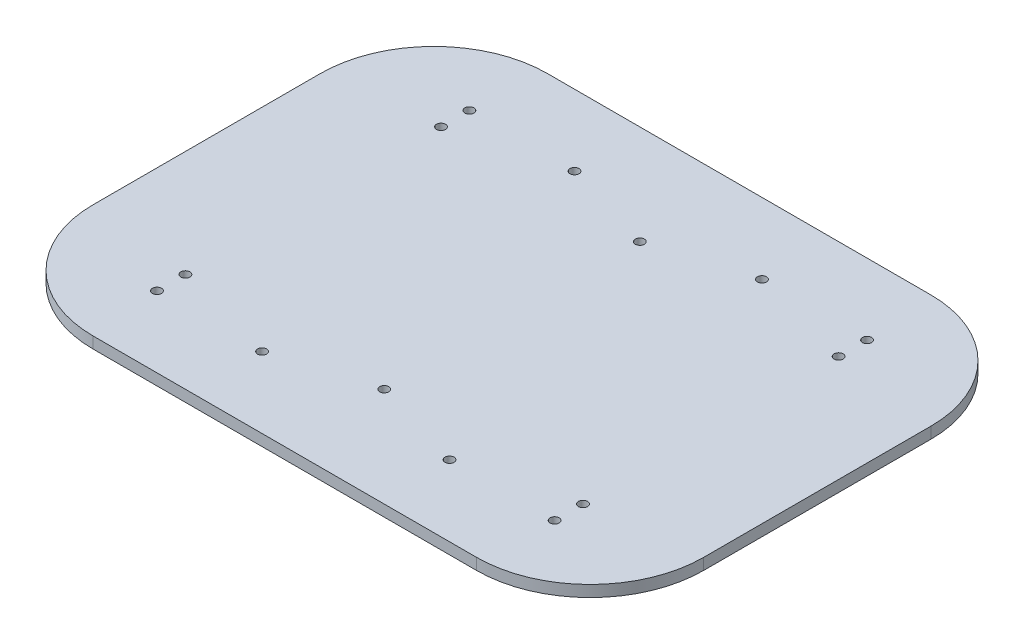
ISO-10303-21;
HEADER;
FILE_DESCRIPTION(('STEP AP214'),'2;1');
FILE_NAME('part.step','',(''),(''),'','','');
FILE_SCHEMA(('AUTOMOTIVE_DESIGN { 1 0 10303 214 1 1 1 1 }'));
ENDSEC;
DATA;
#1=APPLICATION_CONTEXT('core data for automotive mechanical design processes');
#2=APPLICATION_PROTOCOL_DEFINITION('international standard','automotive_design',2000,#1);
#3=PRODUCT_CONTEXT('',#1,'mechanical');
#4=PRODUCT('Part','Part','',(#3));
#5=PRODUCT_RELATED_PRODUCT_CATEGORY('part','',(#4));
#6=PRODUCT_DEFINITION_FORMATION('','',#4);
#7=PRODUCT_DEFINITION_CONTEXT('part definition',#1,'design');
#8=PRODUCT_DEFINITION('design','',#6,#7);
#9=PRODUCT_DEFINITION_SHAPE('','',#8);
#10=(LENGTH_UNIT() NAMED_UNIT(*) SI_UNIT(.MILLI.,.METRE.));
#11=(NAMED_UNIT(*) PLANE_ANGLE_UNIT() SI_UNIT($,.RADIAN.));
#12=(NAMED_UNIT(*) SI_UNIT($,.STERADIAN.) SOLID_ANGLE_UNIT());
#13=UNCERTAINTY_MEASURE_WITH_UNIT(LENGTH_MEASURE(1.E-05),#10,'distance_accuracy_value','');
#14=(GEOMETRIC_REPRESENTATION_CONTEXT(3) GLOBAL_UNCERTAINTY_ASSIGNED_CONTEXT((#13)) GLOBAL_UNIT_ASSIGNED_CONTEXT((#10,
#11,#12)) REPRESENTATION_CONTEXT('',''));
#15=CARTESIAN_POINT('',(0.,0.,0.));
#16=DIRECTION('',(0.,0.,1.));
#17=DIRECTION('',(1.,0.,0.));
#18=AXIS2_PLACEMENT_3D('',#15,#16,#17);
#19=CARTESIAN_POINT('',(-107.5,3.99999999999999,80.));
#20=DIRECTION('',(0.,0.,-1.));
#21=DIRECTION('',(-1.,0.,0.));
#22=AXIS2_PLACEMENT_3D('',#19,#20,#21);
#23=PLANE('',#22);
#24=DIRECTION('',(1.,0.,0.));
#25=VECTOR('',#24,1.);
#26=CARTESIAN_POINT('',(-107.5,0.,80.));
#27=LINE('',#26,#25);
#28=CARTESIAN_POINT('',(-67.5,0.,80.));
#29=VERTEX_POINT('',#28);
#30=CARTESIAN_POINT('',(67.4999999999999,0.,80.));
#31=VERTEX_POINT('',#30);
#32=EDGE_CURVE('E204',#29,#31,#27,.T.);
#33=ORIENTED_EDGE('',*,*,#32,.T.);
#34=DIRECTION('',(0.,-1.,0.));
#35=VECTOR('',#34,1.);
#36=CARTESIAN_POINT('',(67.5,3.99999999999999,80.));
#37=LINE('',#36,#35);
#38=CARTESIAN_POINT('',(67.4999999999999,3.99999999999999,80.));
#39=VERTEX_POINT('',#38);
#40=EDGE_CURVE('E11',#31,#39,#37,.F.);
#41=ORIENTED_EDGE('',*,*,#40,.T.);
#42=DIRECTION('',(1.,0.,0.));
#43=VECTOR('',#42,1.);
#44=CARTESIAN_POINT('',(-107.5,3.99999999999999,80.));
#45=LINE('',#44,#43);
#46=CARTESIAN_POINT('',(-67.5,3.99999999999999,80.));
#47=VERTEX_POINT('',#46);
#48=EDGE_CURVE('E139',#47,#39,#45,.T.);
#49=ORIENTED_EDGE('',*,*,#48,.F.);
#50=DIRECTION('',(0.,-1.,0.));
#51=VECTOR('',#50,1.);
#52=CARTESIAN_POINT('',(-67.5,3.99999999999999,80.));
#53=LINE('',#52,#51);
#54=EDGE_CURVE('E162',#47,#29,#53,.T.);
#55=ORIENTED_EDGE('',*,*,#54,.T.);
#56=EDGE_LOOP('',(#33,#41,#49,#55));
#57=FACE_BOUND('',#56,.T.);
#58=ADVANCED_FACE('F45',(#57),#23,.F.);
#59=CARTESIAN_POINT('',(107.5,3.99999999999999,-80.));
#60=DIRECTION('',(1.,0.,0.));
#61=DIRECTION('',(0.,0.,-1.));
#62=AXIS2_PLACEMENT_3D('',#59,#60,#61);
#63=PLANE('',#62);
#64=DIRECTION('',(0.,0.,1.));
#65=VECTOR('',#64,1.);
#66=CARTESIAN_POINT('',(107.5,0.,-80.));
#67=LINE('',#66,#65);
#68=CARTESIAN_POINT('',(107.5,0.,-40.));
#69=VERTEX_POINT('',#68);
#70=CARTESIAN_POINT('',(107.5,0.,40.));
#71=VERTEX_POINT('',#70);
#72=EDGE_CURVE('E146',#69,#71,#67,.T.);
#73=ORIENTED_EDGE('',*,*,#72,.F.);
#74=DIRECTION('',(0.,-1.,0.));
#75=VECTOR('',#74,1.);
#76=CARTESIAN_POINT('',(107.5,3.99999999999999,-40.));
#77=LINE('',#76,#75);
#78=CARTESIAN_POINT('',(107.5,3.99999999999999,-40.));
#79=VERTEX_POINT('',#78);
#80=EDGE_CURVE('E180',#69,#79,#77,.F.);
#81=ORIENTED_EDGE('',*,*,#80,.T.);
#82=DIRECTION('',(0.,0.,1.));
#83=VECTOR('',#82,1.);
#84=CARTESIAN_POINT('',(107.5,3.99999999999999,-80.));
#85=LINE('',#84,#83);
#86=CARTESIAN_POINT('',(107.5,3.99999999999999,40.));
#87=VERTEX_POINT('',#86);
#88=EDGE_CURVE('E144',#79,#87,#85,.T.);
#89=ORIENTED_EDGE('',*,*,#88,.T.);
#90=DIRECTION('',(0.,-1.,0.));
#91=VECTOR('',#90,1.);
#92=CARTESIAN_POINT('',(107.5,0.,40.));
#93=LINE('',#92,#91);
#94=EDGE_CURVE('E176',#87,#71,#93,.T.);
#95=ORIENTED_EDGE('',*,*,#94,.T.);
#96=EDGE_LOOP('',(#73,#81,#89,#95));
#97=FACE_BOUND('',#96,.T.);
#98=ADVANCED_FACE('F201',(#97),#63,.T.);
#99=CARTESIAN_POINT('',(-107.5,3.99999999999999,-80.));
#100=DIRECTION('',(0.,0.,-1.));
#101=DIRECTION('',(-1.,0.,0.));
#102=AXIS2_PLACEMENT_3D('',#99,#100,#101);
#103=PLANE('',#102);
#104=DIRECTION('',(1.,0.,0.));
#105=VECTOR('',#104,1.);
#106=CARTESIAN_POINT('',(-107.5,3.99999999999999,-80.));
#107=LINE('',#106,#105);
#108=CARTESIAN_POINT('',(-67.5,3.99999999999999,-80.));
#109=VERTEX_POINT('',#108);
#110=CARTESIAN_POINT('',(67.4999999999999,3.99999999999999,-80.));
#111=VERTEX_POINT('',#110);
#112=EDGE_CURVE('E189',#109,#111,#107,.T.);
#113=ORIENTED_EDGE('',*,*,#112,.T.);
#114=DIRECTION('',(0.,-1.,0.));
#115=VECTOR('',#114,1.);
#116=CARTESIAN_POINT('',(67.4999999999999,3.99999999999999,-80.));
#117=LINE('',#116,#115);
#118=CARTESIAN_POINT('',(67.4999999999999,0.,-80.));
#119=VERTEX_POINT('',#118);
#120=EDGE_CURVE('E166',#111,#119,#117,.T.);
#121=ORIENTED_EDGE('',*,*,#120,.T.);
#122=DIRECTION('',(1.,0.,0.));
#123=VECTOR('',#122,1.);
#124=CARTESIAN_POINT('',(-107.5,0.,-80.));
#125=LINE('',#124,#123);
#126=CARTESIAN_POINT('',(-67.5,0.,-80.));
#127=VERTEX_POINT('',#126);
#128=EDGE_CURVE('E140',#127,#119,#125,.T.);
#129=ORIENTED_EDGE('',*,*,#128,.F.);
#130=DIRECTION('',(0.,-1.,0.));
#131=VECTOR('',#130,1.);
#132=CARTESIAN_POINT('',(-67.5,3.99999999999999,-80.));
#133=LINE('',#132,#131);
#134=EDGE_CURVE('E117',#127,#109,#133,.F.);
#135=ORIENTED_EDGE('',*,*,#134,.T.);
#136=EDGE_LOOP('',(#113,#121,#129,#135));
#137=FACE_BOUND('',#136,.T.);
#138=ADVANCED_FACE('F194',(#137),#103,.T.);
#139=CARTESIAN_POINT('',(-107.5,3.99999999999999,-80.));
#140=DIRECTION('',(1.,0.,0.));
#141=DIRECTION('',(0.,0.,-1.));
#142=AXIS2_PLACEMENT_3D('',#139,#140,#141);
#143=PLANE('',#142);
#144=DIRECTION('',(0.,0.,1.));
#145=VECTOR('',#144,1.);
#146=CARTESIAN_POINT('',(-107.5,3.99999999999999,-80.));
#147=LINE('',#146,#145);
#148=CARTESIAN_POINT('',(-107.5,3.99999999999999,-40.));
#149=VERTEX_POINT('',#148);
#150=CARTESIAN_POINT('',(-107.5,3.99999999999999,40.));
#151=VERTEX_POINT('',#150);
#152=EDGE_CURVE('E132',#149,#151,#147,.T.);
#153=ORIENTED_EDGE('',*,*,#152,.F.);
#154=DIRECTION('',(0.,-1.,0.));
#155=VECTOR('',#154,1.);
#156=CARTESIAN_POINT('',(-107.5,0.,-40.));
#157=LINE('',#156,#155);
#158=CARTESIAN_POINT('',(-107.5,0.,-40.));
#159=VERTEX_POINT('',#158);
#160=EDGE_CURVE('E116',#149,#159,#157,.T.);
#161=ORIENTED_EDGE('',*,*,#160,.T.);
#162=DIRECTION('',(0.,0.,1.));
#163=VECTOR('',#162,1.);
#164=CARTESIAN_POINT('',(-107.5,0.,-80.));
#165=LINE('',#164,#163);
#166=CARTESIAN_POINT('',(-107.5,0.,40.));
#167=VERTEX_POINT('',#166);
#168=EDGE_CURVE('E129',#159,#167,#165,.T.);
#169=ORIENTED_EDGE('',*,*,#168,.T.);
#170=DIRECTION('',(0.,-1.,0.));
#171=VECTOR('',#170,1.);
#172=CARTESIAN_POINT('',(-107.5,3.99999999999999,40.));
#173=LINE('',#172,#171);
#174=EDGE_CURVE('E134',#167,#151,#173,.F.);
#175=ORIENTED_EDGE('',*,*,#174,.T.);
#176=EDGE_LOOP('',(#153,#161,#169,#175));
#177=FACE_BOUND('',#176,.T.);
#178=ADVANCED_FACE('F128',(#177),#143,.F.);
#179=CARTESIAN_POINT('',(0.,3.99999999999999,0.));
#180=DIRECTION('',(0.,-1.,0.));
#181=DIRECTION('',(0.,0.,-1.));
#182=AXIS2_PLACEMENT_3D('',#179,#180,#181);
#183=PLANE('',#182);
#184=CARTESIAN_POINT('',(-70.,3.99999999999999,45.));
#185=DIRECTION('',(0.,-1.,0.));
#186=DIRECTION('',(0.,0.,1.));
#187=AXIS2_PLACEMENT_3D('',#184,#185,#186);
#188=CIRCLE('',#187,1.60000000000001);
#189=CARTESIAN_POINT('',(-70.,3.99999999999999,46.6));
#190=VERTEX_POINT('',#189);
#191=EDGE_CURVE('E285',#190,#190,#188,.T.);
#192=ORIENTED_EDGE('',*,*,#191,.T.);
#193=EDGE_LOOP('',(#192));
#194=FACE_BOUND('',#193,.T.);
#195=CARTESIAN_POINT('',(0.,3.99999999999999,45.));
#196=DIRECTION('',(0.,-1.,0.));
#197=DIRECTION('',(0.,0.,1.));
#198=AXIS2_PLACEMENT_3D('',#195,#196,#197);
#199=CIRCLE('',#198,1.6);
#200=CARTESIAN_POINT('',(0.,3.99999999999999,46.6));
#201=VERTEX_POINT('',#200);
#202=EDGE_CURVE('E293',#201,#201,#199,.T.);
#203=ORIENTED_EDGE('',*,*,#202,.T.);
#204=EDGE_LOOP('',(#203));
#205=FACE_BOUND('',#204,.T.);
#206=CARTESIAN_POINT('',(70.,3.99999999999999,45.));
#207=DIRECTION('',(0.,-1.,0.));
#208=DIRECTION('',(0.,0.,1.));
#209=AXIS2_PLACEMENT_3D('',#206,#207,#208);
#210=CIRCLE('',#209,1.60000000000001);
#211=CARTESIAN_POINT('',(70.,3.99999999999999,46.6));
#212=VERTEX_POINT('',#211);
#213=EDGE_CURVE('E301',#212,#212,#210,.T.);
#214=ORIENTED_EDGE('',*,*,#213,.T.);
#215=EDGE_LOOP('',(#214));
#216=FACE_BOUND('',#215,.T.);
#217=CARTESIAN_POINT('',(70.,3.99999999999999,-45.));
#218=DIRECTION('',(0.,-1.,0.));
#219=DIRECTION('',(0.,0.,-1.));
#220=AXIS2_PLACEMENT_3D('',#217,#218,#219);
#221=CIRCLE('',#220,1.60000000000001);
#222=CARTESIAN_POINT('',(70.,3.99999999999999,-46.6));
#223=VERTEX_POINT('',#222);
#224=EDGE_CURVE('E309',#223,#223,#221,.T.);
#225=ORIENTED_EDGE('',*,*,#224,.T.);
#226=EDGE_LOOP('',(#225));
#227=FACE_BOUND('',#226,.T.);
#228=CARTESIAN_POINT('',(0.,3.99999999999999,-45.));
#229=DIRECTION('',(0.,-1.,0.));
#230=DIRECTION('',(0.,0.,-1.));
#231=AXIS2_PLACEMENT_3D('',#228,#229,#230);
#232=CIRCLE('',#231,1.6);
#233=CARTESIAN_POINT('',(0.,3.99999999999999,-46.6));
#234=VERTEX_POINT('',#233);
#235=EDGE_CURVE('E317',#234,#234,#232,.T.);
#236=ORIENTED_EDGE('',*,*,#235,.T.);
#237=EDGE_LOOP('',(#236));
#238=FACE_BOUND('',#237,.T.);
#239=CARTESIAN_POINT('',(-70.,3.99999999999999,-45.));
#240=DIRECTION('',(0.,-1.,0.));
#241=DIRECTION('',(0.,0.,-1.));
#242=AXIS2_PLACEMENT_3D('',#239,#240,#241);
#243=CIRCLE('',#242,1.60000000000001);
#244=CARTESIAN_POINT('',(-70.,3.99999999999999,-46.6));
#245=VERTEX_POINT('',#244);
#246=EDGE_CURVE('E276',#245,#245,#243,.T.);
#247=ORIENTED_EDGE('',*,*,#246,.T.);
#248=EDGE_LOOP('',(#247));
#249=FACE_BOUND('',#248,.T.);
#250=CARTESIAN_POINT('',(-70.,3.99999999999999,55.));
#251=DIRECTION('',(0.,-1.,0.));
#252=DIRECTION('',(0.,0.,-1.));
#253=AXIS2_PLACEMENT_3D('',#250,#251,#252);
#254=CIRCLE('',#253,1.6);
#255=CARTESIAN_POINT('',(-70.,3.99999999999999,53.4));
#256=VERTEX_POINT('',#255);
#257=EDGE_CURVE('E268',#256,#256,#254,.T.);
#258=ORIENTED_EDGE('',*,*,#257,.T.);
#259=EDGE_LOOP('',(#258));
#260=FACE_BOUND('',#259,.T.);
#261=CARTESIAN_POINT('',(33.,3.99999999999999,55.));
#262=DIRECTION('',(0.,-1.,0.));
#263=DIRECTION('',(0.,0.,-1.));
#264=AXIS2_PLACEMENT_3D('',#261,#262,#263);
#265=CIRCLE('',#264,1.6);
#266=CARTESIAN_POINT('',(33.,3.99999999999999,53.4));
#267=VERTEX_POINT('',#266);
#268=EDGE_CURVE('E260',#267,#267,#265,.T.);
#269=ORIENTED_EDGE('',*,*,#268,.T.);
#270=EDGE_LOOP('',(#269));
#271=FACE_BOUND('',#270,.T.);
#272=CARTESIAN_POINT('',(-33.,3.99999999999999,55.));
#273=DIRECTION('',(0.,-1.,0.));
#274=DIRECTION('',(0.,0.,-1.));
#275=AXIS2_PLACEMENT_3D('',#272,#273,#274);
#276=CIRCLE('',#275,1.6);
#277=CARTESIAN_POINT('',(-33.,3.99999999999999,53.4));
#278=VERTEX_POINT('',#277);
#279=EDGE_CURVE('E252',#278,#278,#276,.T.);
#280=ORIENTED_EDGE('',*,*,#279,.T.);
#281=EDGE_LOOP('',(#280));
#282=FACE_BOUND('',#281,.T.);
#283=CARTESIAN_POINT('',(70.,3.99999999999999,55.));
#284=DIRECTION('',(0.,-1.,0.));
#285=DIRECTION('',(0.,0.,-1.));
#286=AXIS2_PLACEMENT_3D('',#283,#284,#285);
#287=CIRCLE('',#286,1.6);
#288=CARTESIAN_POINT('',(70.,3.99999999999999,53.4));
#289=VERTEX_POINT('',#288);
#290=EDGE_CURVE('E244',#289,#289,#287,.T.);
#291=ORIENTED_EDGE('',*,*,#290,.T.);
#292=EDGE_LOOP('',(#291));
#293=FACE_BOUND('',#292,.T.);
#294=CARTESIAN_POINT('',(70.,3.99999999999999,-55.));
#295=DIRECTION('',(0.,-1.,0.));
#296=DIRECTION('',(0.,0.,-1.));
#297=AXIS2_PLACEMENT_3D('',#294,#295,#296);
#298=CIRCLE('',#297,1.6);
#299=CARTESIAN_POINT('',(70.,3.99999999999999,-56.6));
#300=VERTEX_POINT('',#299);
#301=EDGE_CURVE('E236',#300,#300,#298,.T.);
#302=ORIENTED_EDGE('',*,*,#301,.T.);
#303=EDGE_LOOP('',(#302));
#304=FACE_BOUND('',#303,.T.);
#305=CARTESIAN_POINT('',(33.,3.99999999999999,-55.));
#306=DIRECTION('',(0.,-1.,0.));
#307=DIRECTION('',(0.,0.,-1.));
#308=AXIS2_PLACEMENT_3D('',#305,#306,#307);
#309=CIRCLE('',#308,1.6);
#310=CARTESIAN_POINT('',(33.,3.99999999999999,-56.6));
#311=VERTEX_POINT('',#310);
#312=EDGE_CURVE('E228',#311,#311,#309,.T.);
#313=ORIENTED_EDGE('',*,*,#312,.T.);
#314=EDGE_LOOP('',(#313));
#315=FACE_BOUND('',#314,.T.);
#316=CARTESIAN_POINT('',(-33.,3.99999999999999,-55.));
#317=DIRECTION('',(0.,-1.,0.));
#318=DIRECTION('',(0.,0.,-1.));
#319=AXIS2_PLACEMENT_3D('',#316,#317,#318);
#320=CIRCLE('',#319,1.6);
#321=CARTESIAN_POINT('',(-33.,3.99999999999999,-56.6));
#322=VERTEX_POINT('',#321);
#323=EDGE_CURVE('E220',#322,#322,#320,.T.);
#324=ORIENTED_EDGE('',*,*,#323,.T.);
#325=EDGE_LOOP('',(#324));
#326=FACE_BOUND('',#325,.T.);
#327=CARTESIAN_POINT('',(-70.,3.99999999999999,-55.));
#328=DIRECTION('',(0.,-1.,0.));
#329=DIRECTION('',(0.,0.,-1.));
#330=AXIS2_PLACEMENT_3D('',#327,#328,#329);
#331=CIRCLE('',#330,1.6);
#332=CARTESIAN_POINT('',(-70.,3.99999999999999,-56.6));
#333=VERTEX_POINT('',#332);
#334=EDGE_CURVE('E206',#333,#333,#331,.T.);
#335=ORIENTED_EDGE('',*,*,#334,.T.);
#336=EDGE_LOOP('',(#335));
#337=FACE_BOUND('',#336,.T.);
#338=ORIENTED_EDGE('',*,*,#88,.F.);
#339=CARTESIAN_POINT('',(67.4999999999999,3.99999999999999,-40.));
#340=DIRECTION('',(0.,-1.,0.));
#341=DIRECTION('',(0.,0.,-1.));
#342=AXIS2_PLACEMENT_3D('',#339,#340,#341);
#343=CIRCLE('',#342,40.);
#344=EDGE_CURVE('E54',#79,#111,#343,.F.);
#345=ORIENTED_EDGE('',*,*,#344,.T.);
#346=ORIENTED_EDGE('',*,*,#112,.F.);
#347=CARTESIAN_POINT('',(-67.5,3.99999999999999,-40.));
#348=DIRECTION('',(0.,-1.,0.));
#349=DIRECTION('',(0.,0.,-1.));
#350=AXIS2_PLACEMENT_3D('',#347,#348,#349);
#351=CIRCLE('',#350,40.);
#352=EDGE_CURVE('E159',#109,#149,#351,.F.);
#353=ORIENTED_EDGE('',*,*,#352,.T.);
#354=ORIENTED_EDGE('',*,*,#152,.T.);
#355=CARTESIAN_POINT('',(-67.5,3.99999999999999,40.));
#356=DIRECTION('',(0.,-1.,0.));
#357=DIRECTION('',(0.,0.,-1.));
#358=AXIS2_PLACEMENT_3D('',#355,#356,#357);
#359=CIRCLE('',#358,40.);
#360=EDGE_CURVE('E156',#151,#47,#359,.F.);
#361=ORIENTED_EDGE('',*,*,#360,.T.);
#362=ORIENTED_EDGE('',*,*,#48,.T.);
#363=CARTESIAN_POINT('',(67.5,3.99999999999999,40.));
#364=DIRECTION('',(0.,-1.,0.));
#365=DIRECTION('',(0.,0.,-1.));
#366=AXIS2_PLACEMENT_3D('',#363,#364,#365);
#367=CIRCLE('',#366,40.);
#368=EDGE_CURVE('E66',#39,#87,#367,.F.);
#369=ORIENTED_EDGE('',*,*,#368,.T.);
#370=EDGE_LOOP('',(#338,#345,#346,#353,#354,#361,#362,#369));
#371=FACE_BOUND('',#370,.T.);
#372=ADVANCED_FACE('F188',(#194,#205,#216,#227,#238,#249,#260,#271,#282,#293,#304,#315,#326,
#337,#371),#183,.F.);
#373=CARTESIAN_POINT('',(0.,0.,0.));
#374=DIRECTION('',(0.,-1.,0.));
#375=DIRECTION('',(0.,0.,-1.));
#376=AXIS2_PLACEMENT_3D('',#373,#374,#375);
#377=PLANE('',#376);
#378=CARTESIAN_POINT('',(-70.,0.,45.));
#379=DIRECTION('',(0.,-1.,0.));
#380=DIRECTION('',(0.,0.,1.));
#381=AXIS2_PLACEMENT_3D('',#378,#379,#380);
#382=CIRCLE('',#381,1.60000000000001);
#383=CARTESIAN_POINT('',(-70.,0.,46.6));
#384=VERTEX_POINT('',#383);
#385=EDGE_CURVE('E289',#384,#384,#382,.T.);
#386=ORIENTED_EDGE('',*,*,#385,.F.);
#387=EDGE_LOOP('',(#386));
#388=FACE_BOUND('',#387,.T.);
#389=CARTESIAN_POINT('',(0.,0.,45.));
#390=DIRECTION('',(0.,-1.,0.));
#391=DIRECTION('',(0.,0.,1.));
#392=AXIS2_PLACEMENT_3D('',#389,#390,#391);
#393=CIRCLE('',#392,1.6);
#394=CARTESIAN_POINT('',(0.,0.,46.6));
#395=VERTEX_POINT('',#394);
#396=EDGE_CURVE('E297',#395,#395,#393,.T.);
#397=ORIENTED_EDGE('',*,*,#396,.F.);
#398=EDGE_LOOP('',(#397));
#399=FACE_BOUND('',#398,.T.);
#400=CARTESIAN_POINT('',(70.,0.,45.));
#401=DIRECTION('',(0.,-1.,0.));
#402=DIRECTION('',(0.,0.,1.));
#403=AXIS2_PLACEMENT_3D('',#400,#401,#402);
#404=CIRCLE('',#403,1.60000000000001);
#405=CARTESIAN_POINT('',(70.,0.,46.6));
#406=VERTEX_POINT('',#405);
#407=EDGE_CURVE('E305',#406,#406,#404,.T.);
#408=ORIENTED_EDGE('',*,*,#407,.F.);
#409=EDGE_LOOP('',(#408));
#410=FACE_BOUND('',#409,.T.);
#411=CARTESIAN_POINT('',(70.,0.,-45.));
#412=DIRECTION('',(0.,-1.,0.));
#413=DIRECTION('',(0.,0.,-1.));
#414=AXIS2_PLACEMENT_3D('',#411,#412,#413);
#415=CIRCLE('',#414,1.60000000000001);
#416=CARTESIAN_POINT('',(70.,0.,-46.6));
#417=VERTEX_POINT('',#416);
#418=EDGE_CURVE('E313',#417,#417,#415,.T.);
#419=ORIENTED_EDGE('',*,*,#418,.F.);
#420=EDGE_LOOP('',(#419));
#421=FACE_BOUND('',#420,.T.);
#422=CARTESIAN_POINT('',(0.,0.,-45.));
#423=DIRECTION('',(0.,-1.,0.));
#424=DIRECTION('',(0.,0.,-1.));
#425=AXIS2_PLACEMENT_3D('',#422,#423,#424);
#426=CIRCLE('',#425,1.6);
#427=CARTESIAN_POINT('',(0.,0.,-46.6));
#428=VERTEX_POINT('',#427);
#429=EDGE_CURVE('E281',#428,#428,#426,.T.);
#430=ORIENTED_EDGE('',*,*,#429,.F.);
#431=EDGE_LOOP('',(#430));
#432=FACE_BOUND('',#431,.T.);
#433=CARTESIAN_POINT('',(-70.,0.,-45.));
#434=DIRECTION('',(0.,-1.,0.));
#435=DIRECTION('',(0.,0.,-1.));
#436=AXIS2_PLACEMENT_3D('',#433,#434,#435);
#437=CIRCLE('',#436,1.60000000000001);
#438=CARTESIAN_POINT('',(-70.,0.,-46.6));
#439=VERTEX_POINT('',#438);
#440=EDGE_CURVE('E277',#439,#439,#437,.T.);
#441=ORIENTED_EDGE('',*,*,#440,.F.);
#442=EDGE_LOOP('',(#441));
#443=FACE_BOUND('',#442,.T.);
#444=CARTESIAN_POINT('',(-70.,0.,55.));
#445=DIRECTION('',(0.,-1.,0.));
#446=DIRECTION('',(0.,0.,-1.));
#447=AXIS2_PLACEMENT_3D('',#444,#445,#446);
#448=CIRCLE('',#447,1.6);
#449=CARTESIAN_POINT('',(-70.,0.,53.4));
#450=VERTEX_POINT('',#449);
#451=EDGE_CURVE('E272',#450,#450,#448,.T.);
#452=ORIENTED_EDGE('',*,*,#451,.F.);
#453=EDGE_LOOP('',(#452));
#454=FACE_BOUND('',#453,.T.);
#455=CARTESIAN_POINT('',(33.,0.,55.));
#456=DIRECTION('',(0.,-1.,0.));
#457=DIRECTION('',(0.,0.,-1.));
#458=AXIS2_PLACEMENT_3D('',#455,#456,#457);
#459=CIRCLE('',#458,1.6);
#460=CARTESIAN_POINT('',(33.,0.,53.4));
#461=VERTEX_POINT('',#460);
#462=EDGE_CURVE('E264',#461,#461,#459,.T.);
#463=ORIENTED_EDGE('',*,*,#462,.F.);
#464=EDGE_LOOP('',(#463));
#465=FACE_BOUND('',#464,.T.);
#466=CARTESIAN_POINT('',(-33.,0.,55.));
#467=DIRECTION('',(0.,-1.,0.));
#468=DIRECTION('',(0.,0.,-1.));
#469=AXIS2_PLACEMENT_3D('',#466,#467,#468);
#470=CIRCLE('',#469,1.6);
#471=CARTESIAN_POINT('',(-33.,0.,53.4));
#472=VERTEX_POINT('',#471);
#473=EDGE_CURVE('E256',#472,#472,#470,.T.);
#474=ORIENTED_EDGE('',*,*,#473,.F.);
#475=EDGE_LOOP('',(#474));
#476=FACE_BOUND('',#475,.T.);
#477=CARTESIAN_POINT('',(70.,0.,55.));
#478=DIRECTION('',(0.,-1.,0.));
#479=DIRECTION('',(0.,0.,-1.));
#480=AXIS2_PLACEMENT_3D('',#477,#478,#479);
#481=CIRCLE('',#480,1.6);
#482=CARTESIAN_POINT('',(70.,0.,53.4));
#483=VERTEX_POINT('',#482);
#484=EDGE_CURVE('E248',#483,#483,#481,.T.);
#485=ORIENTED_EDGE('',*,*,#484,.F.);
#486=EDGE_LOOP('',(#485));
#487=FACE_BOUND('',#486,.T.);
#488=CARTESIAN_POINT('',(70.,0.,-55.));
#489=DIRECTION('',(0.,-1.,0.));
#490=DIRECTION('',(0.,0.,-1.));
#491=AXIS2_PLACEMENT_3D('',#488,#489,#490);
#492=CIRCLE('',#491,1.6);
#493=CARTESIAN_POINT('',(70.,0.,-56.6));
#494=VERTEX_POINT('',#493);
#495=EDGE_CURVE('E240',#494,#494,#492,.T.);
#496=ORIENTED_EDGE('',*,*,#495,.F.);
#497=EDGE_LOOP('',(#496));
#498=FACE_BOUND('',#497,.T.);
#499=CARTESIAN_POINT('',(33.,0.,-55.));
#500=DIRECTION('',(0.,-1.,0.));
#501=DIRECTION('',(0.,0.,-1.));
#502=AXIS2_PLACEMENT_3D('',#499,#500,#501);
#503=CIRCLE('',#502,1.6);
#504=CARTESIAN_POINT('',(33.,0.,-56.6));
#505=VERTEX_POINT('',#504);
#506=EDGE_CURVE('E232',#505,#505,#503,.T.);
#507=ORIENTED_EDGE('',*,*,#506,.F.);
#508=EDGE_LOOP('',(#507));
#509=FACE_BOUND('',#508,.T.);
#510=CARTESIAN_POINT('',(-33.,0.,-55.));
#511=DIRECTION('',(0.,-1.,0.));
#512=DIRECTION('',(0.,0.,-1.));
#513=AXIS2_PLACEMENT_3D('',#510,#511,#512);
#514=CIRCLE('',#513,1.6);
#515=CARTESIAN_POINT('',(-33.,0.,-56.6));
#516=VERTEX_POINT('',#515);
#517=EDGE_CURVE('E224',#516,#516,#514,.T.);
#518=ORIENTED_EDGE('',*,*,#517,.F.);
#519=EDGE_LOOP('',(#518));
#520=FACE_BOUND('',#519,.T.);
#521=CARTESIAN_POINT('',(-70.,0.,-55.));
#522=DIRECTION('',(0.,-1.,0.));
#523=DIRECTION('',(0.,0.,-1.));
#524=AXIS2_PLACEMENT_3D('',#521,#522,#523);
#525=CIRCLE('',#524,1.6);
#526=CARTESIAN_POINT('',(-70.,0.,-56.6));
#527=VERTEX_POINT('',#526);
#528=EDGE_CURVE('E216',#527,#527,#525,.T.);
#529=ORIENTED_EDGE('',*,*,#528,.F.);
#530=EDGE_LOOP('',(#529));
#531=FACE_BOUND('',#530,.T.);
#532=ORIENTED_EDGE('',*,*,#128,.T.);
#533=CARTESIAN_POINT('',(67.4999999999999,0.,-40.));
#534=DIRECTION('',(0.,-1.,0.));
#535=DIRECTION('',(0.,0.,-1.));
#536=AXIS2_PLACEMENT_3D('',#533,#534,#535);
#537=CIRCLE('',#536,40.);
#538=EDGE_CURVE('E173',#119,#69,#537,.T.);
#539=ORIENTED_EDGE('',*,*,#538,.T.);
#540=ORIENTED_EDGE('',*,*,#72,.T.);
#541=CARTESIAN_POINT('',(67.5,0.,40.));
#542=DIRECTION('',(0.,-1.,0.));
#543=DIRECTION('',(0.,0.,-1.));
#544=AXIS2_PLACEMENT_3D('',#541,#542,#543);
#545=CIRCLE('',#544,40.);
#546=EDGE_CURVE('E170',#71,#31,#545,.T.);
#547=ORIENTED_EDGE('',*,*,#546,.T.);
#548=ORIENTED_EDGE('',*,*,#32,.F.);
#549=CARTESIAN_POINT('',(-67.5,0.,40.));
#550=DIRECTION('',(0.,-1.,0.));
#551=DIRECTION('',(0.,0.,-1.));
#552=AXIS2_PLACEMENT_3D('',#549,#550,#551);
#553=CIRCLE('',#552,40.);
#554=EDGE_CURVE('E123',#29,#167,#553,.T.);
#555=ORIENTED_EDGE('',*,*,#554,.T.);
#556=ORIENTED_EDGE('',*,*,#168,.F.);
#557=CARTESIAN_POINT('',(-67.5,0.,-40.));
#558=DIRECTION('',(0.,-1.,0.));
#559=DIRECTION('',(0.,0.,-1.));
#560=AXIS2_PLACEMENT_3D('',#557,#558,#559);
#561=CIRCLE('',#560,40.);
#562=EDGE_CURVE('E112',#159,#127,#561,.T.);
#563=ORIENTED_EDGE('',*,*,#562,.T.);
#564=EDGE_LOOP('',(#532,#539,#540,#547,#548,#555,#556,#563));
#565=FACE_BOUND('',#564,.T.);
#566=ADVANCED_FACE('F136',(#388,#399,#410,#421,#432,#443,#454,#465,#476,#487,#498,#509,#520,
#531,#565),#377,.T.);
#567=CARTESIAN_POINT('',(-70.,0.,-55.));
#568=DIRECTION('',(0.,-1.,0.));
#569=DIRECTION('',(0.,0.,-1.));
#570=AXIS2_PLACEMENT_3D('',#567,#568,#569);
#571=CYLINDRICAL_SURFACE('',#570,1.6);
#572=ORIENTED_EDGE('',*,*,#334,.F.);
#573=EDGE_LOOP('',(#572));
#574=FACE_BOUND('',#573,.T.);
#575=ORIENTED_EDGE('',*,*,#528,.T.);
#576=EDGE_LOOP('',(#575));
#577=FACE_BOUND('',#576,.T.);
#578=ADVANCED_FACE('F329',(#574,#577),#571,.F.);
#579=CARTESIAN_POINT('',(-33.,0.,-55.));
#580=DIRECTION('',(0.,-1.,0.));
#581=DIRECTION('',(0.,0.,-1.));
#582=AXIS2_PLACEMENT_3D('',#579,#580,#581);
#583=CYLINDRICAL_SURFACE('',#582,1.6);
#584=ORIENTED_EDGE('',*,*,#323,.F.);
#585=EDGE_LOOP('',(#584));
#586=FACE_BOUND('',#585,.T.);
#587=ORIENTED_EDGE('',*,*,#517,.T.);
#588=EDGE_LOOP('',(#587));
#589=FACE_BOUND('',#588,.T.);
#590=ADVANCED_FACE('F351',(#586,#589),#583,.F.);
#591=CARTESIAN_POINT('',(33.,0.,-55.));
#592=DIRECTION('',(0.,-1.,0.));
#593=DIRECTION('',(0.,0.,-1.));
#594=AXIS2_PLACEMENT_3D('',#591,#592,#593);
#595=CYLINDRICAL_SURFACE('',#594,1.6);
#596=ORIENTED_EDGE('',*,*,#312,.F.);
#597=EDGE_LOOP('',(#596));
#598=FACE_BOUND('',#597,.T.);
#599=ORIENTED_EDGE('',*,*,#506,.T.);
#600=EDGE_LOOP('',(#599));
#601=FACE_BOUND('',#600,.T.);
#602=ADVANCED_FACE('F357',(#598,#601),#595,.F.);
#603=CARTESIAN_POINT('',(70.,0.,-55.));
#604=DIRECTION('',(0.,-1.,0.));
#605=DIRECTION('',(0.,0.,-1.));
#606=AXIS2_PLACEMENT_3D('',#603,#604,#605);
#607=CYLINDRICAL_SURFACE('',#606,1.6);
#608=ORIENTED_EDGE('',*,*,#301,.F.);
#609=EDGE_LOOP('',(#608));
#610=FACE_BOUND('',#609,.T.);
#611=ORIENTED_EDGE('',*,*,#495,.T.);
#612=EDGE_LOOP('',(#611));
#613=FACE_BOUND('',#612,.T.);
#614=ADVANCED_FACE('F417',(#610,#613),#607,.F.);
#615=CARTESIAN_POINT('',(70.,0.,55.));
#616=DIRECTION('',(0.,-1.,0.));
#617=DIRECTION('',(0.,0.,-1.));
#618=AXIS2_PLACEMENT_3D('',#615,#616,#617);
#619=CYLINDRICAL_SURFACE('',#618,1.6);
#620=ORIENTED_EDGE('',*,*,#290,.F.);
#621=EDGE_LOOP('',(#620));
#622=FACE_BOUND('',#621,.T.);
#623=ORIENTED_EDGE('',*,*,#484,.T.);
#624=EDGE_LOOP('',(#623));
#625=FACE_BOUND('',#624,.T.);
#626=ADVANCED_FACE('F413',(#622,#625),#619,.F.);
#627=CARTESIAN_POINT('',(-33.,0.,55.));
#628=DIRECTION('',(0.,-1.,0.));
#629=DIRECTION('',(0.,0.,-1.));
#630=AXIS2_PLACEMENT_3D('',#627,#628,#629);
#631=CYLINDRICAL_SURFACE('',#630,1.6);
#632=ORIENTED_EDGE('',*,*,#279,.F.);
#633=EDGE_LOOP('',(#632));
#634=FACE_BOUND('',#633,.T.);
#635=ORIENTED_EDGE('',*,*,#473,.T.);
#636=EDGE_LOOP('',(#635));
#637=FACE_BOUND('',#636,.T.);
#638=ADVANCED_FACE('F409',(#634,#637),#631,.F.);
#639=CARTESIAN_POINT('',(33.,0.,55.));
#640=DIRECTION('',(0.,-1.,0.));
#641=DIRECTION('',(0.,0.,-1.));
#642=AXIS2_PLACEMENT_3D('',#639,#640,#641);
#643=CYLINDRICAL_SURFACE('',#642,1.6);
#644=ORIENTED_EDGE('',*,*,#268,.F.);
#645=EDGE_LOOP('',(#644));
#646=FACE_BOUND('',#645,.T.);
#647=ORIENTED_EDGE('',*,*,#462,.T.);
#648=EDGE_LOOP('',(#647));
#649=FACE_BOUND('',#648,.T.);
#650=ADVANCED_FACE('F405',(#646,#649),#643,.F.);
#651=CARTESIAN_POINT('',(-70.,0.,55.));
#652=DIRECTION('',(0.,-1.,0.));
#653=DIRECTION('',(0.,0.,-1.));
#654=AXIS2_PLACEMENT_3D('',#651,#652,#653);
#655=CYLINDRICAL_SURFACE('',#654,1.6);
#656=ORIENTED_EDGE('',*,*,#257,.F.);
#657=EDGE_LOOP('',(#656));
#658=FACE_BOUND('',#657,.T.);
#659=ORIENTED_EDGE('',*,*,#451,.T.);
#660=EDGE_LOOP('',(#659));
#661=FACE_BOUND('',#660,.T.);
#662=ADVANCED_FACE('F374',(#658,#661),#655,.F.);
#663=CARTESIAN_POINT('',(-67.5,3.99999999999999,-40.));
#664=DIRECTION('',(0.,1.,0.));
#665=DIRECTION('',(0.,0.,1.));
#666=AXIS2_PLACEMENT_3D('',#663,#664,#665);
#667=CYLINDRICAL_SURFACE('',#666,40.);
#668=ORIENTED_EDGE('',*,*,#352,.F.);
#669=ORIENTED_EDGE('',*,*,#134,.F.);
#670=ORIENTED_EDGE('',*,*,#562,.F.);
#671=ORIENTED_EDGE('',*,*,#160,.F.);
#672=EDGE_LOOP('',(#668,#669,#670,#671));
#673=FACE_BOUND('',#672,.T.);
#674=ADVANCED_FACE('F115',(#673),#667,.T.);
#675=CARTESIAN_POINT('',(-67.5,3.99999999999999,40.));
#676=DIRECTION('',(0.,-1.,0.));
#677=DIRECTION('',(0.,0.,-1.));
#678=AXIS2_PLACEMENT_3D('',#675,#676,#677);
#679=CYLINDRICAL_SURFACE('',#678,40.);
#680=ORIENTED_EDGE('',*,*,#360,.F.);
#681=ORIENTED_EDGE('',*,*,#174,.F.);
#682=ORIENTED_EDGE('',*,*,#554,.F.);
#683=ORIENTED_EDGE('',*,*,#54,.F.);
#684=EDGE_LOOP('',(#680,#681,#682,#683));
#685=FACE_BOUND('',#684,.T.);
#686=ADVANCED_FACE('F373',(#685),#679,.T.);
#687=CARTESIAN_POINT('',(67.4999999999999,3.99999999999999,-40.));
#688=DIRECTION('',(0.,-1.,0.));
#689=DIRECTION('',(0.,0.,-1.));
#690=AXIS2_PLACEMENT_3D('',#687,#688,#689);
#691=CYLINDRICAL_SURFACE('',#690,40.);
#692=ORIENTED_EDGE('',*,*,#344,.F.);
#693=ORIENTED_EDGE('',*,*,#80,.F.);
#694=ORIENTED_EDGE('',*,*,#538,.F.);
#695=ORIENTED_EDGE('',*,*,#120,.F.);
#696=EDGE_LOOP('',(#692,#693,#694,#695));
#697=FACE_BOUND('',#696,.T.);
#698=ADVANCED_FACE('F197',(#697),#691,.T.);
#699=CARTESIAN_POINT('',(67.5,3.99999999999999,40.));
#700=DIRECTION('',(0.,1.,0.));
#701=DIRECTION('',(0.,0.,1.));
#702=AXIS2_PLACEMENT_3D('',#699,#700,#701);
#703=CYLINDRICAL_SURFACE('',#702,40.);
#704=ORIENTED_EDGE('',*,*,#368,.F.);
#705=ORIENTED_EDGE('',*,*,#40,.F.);
#706=ORIENTED_EDGE('',*,*,#546,.F.);
#707=ORIENTED_EDGE('',*,*,#94,.F.);
#708=EDGE_LOOP('',(#704,#705,#706,#707));
#709=FACE_BOUND('',#708,.T.);
#710=ADVANCED_FACE('F47',(#709),#703,.T.);
#711=CARTESIAN_POINT('',(-70.,3.99999999999999,-45.));
#712=DIRECTION('',(0.,-1.,0.));
#713=DIRECTION('',(0.,0.,-1.));
#714=AXIS2_PLACEMENT_3D('',#711,#712,#713);
#715=CYLINDRICAL_SURFACE('',#714,1.60000000000001);
#716=ORIENTED_EDGE('',*,*,#246,.F.);
#717=EDGE_LOOP('',(#716));
#718=FACE_BOUND('',#717,.T.);
#719=ORIENTED_EDGE('',*,*,#440,.T.);
#720=EDGE_LOOP('',(#719));
#721=FACE_BOUND('',#720,.T.);
#722=ADVANCED_FACE('F381',(#718,#721),#715,.F.);
#723=CARTESIAN_POINT('',(0.,3.99999999999999,-45.));
#724=DIRECTION('',(0.,-1.,0.));
#725=DIRECTION('',(0.,0.,-1.));
#726=AXIS2_PLACEMENT_3D('',#723,#724,#725);
#727=CYLINDRICAL_SURFACE('',#726,1.6);
#728=ORIENTED_EDGE('',*,*,#235,.F.);
#729=EDGE_LOOP('',(#728));
#730=FACE_BOUND('',#729,.T.);
#731=ORIENTED_EDGE('',*,*,#429,.T.);
#732=EDGE_LOOP('',(#731));
#733=FACE_BOUND('',#732,.T.);
#734=ADVANCED_FACE('F325',(#730,#733),#727,.F.);
#735=CARTESIAN_POINT('',(70.,3.99999999999999,-45.));
#736=DIRECTION('',(0.,-1.,0.));
#737=DIRECTION('',(0.,0.,-1.));
#738=AXIS2_PLACEMENT_3D('',#735,#736,#737);
#739=CYLINDRICAL_SURFACE('',#738,1.60000000000001);
#740=ORIENTED_EDGE('',*,*,#224,.F.);
#741=EDGE_LOOP('',(#740));
#742=FACE_BOUND('',#741,.T.);
#743=ORIENTED_EDGE('',*,*,#418,.T.);
#744=EDGE_LOOP('',(#743));
#745=FACE_BOUND('',#744,.T.);
#746=ADVANCED_FACE('F394',(#742,#745),#739,.F.);
#747=CARTESIAN_POINT('',(70.,3.99999999999999,45.));
#748=DIRECTION('',(0.,-1.,0.));
#749=DIRECTION('',(0.,0.,-1.));
#750=AXIS2_PLACEMENT_3D('',#747,#748,#749);
#751=CYLINDRICAL_SURFACE('',#750,1.60000000000001);
#752=ORIENTED_EDGE('',*,*,#213,.F.);
#753=EDGE_LOOP('',(#752));
#754=FACE_BOUND('',#753,.T.);
#755=ORIENTED_EDGE('',*,*,#407,.T.);
#756=EDGE_LOOP('',(#755));
#757=FACE_BOUND('',#756,.T.);
#758=ADVANCED_FACE('F539',(#754,#757),#751,.F.);
#759=CARTESIAN_POINT('',(0.,3.99999999999999,45.));
#760=DIRECTION('',(0.,-1.,0.));
#761=DIRECTION('',(0.,0.,-1.));
#762=AXIS2_PLACEMENT_3D('',#759,#760,#761);
#763=CYLINDRICAL_SURFACE('',#762,1.6);
#764=ORIENTED_EDGE('',*,*,#202,.F.);
#765=EDGE_LOOP('',(#764));
#766=FACE_BOUND('',#765,.T.);
#767=ORIENTED_EDGE('',*,*,#396,.T.);
#768=EDGE_LOOP('',(#767));
#769=FACE_BOUND('',#768,.T.);
#770=ADVANCED_FACE('F548',(#766,#769),#763,.F.);
#771=CARTESIAN_POINT('',(-70.,3.99999999999999,45.));
#772=DIRECTION('',(0.,-1.,0.));
#773=DIRECTION('',(0.,0.,-1.));
#774=AXIS2_PLACEMENT_3D('',#771,#772,#773);
#775=CYLINDRICAL_SURFACE('',#774,1.60000000000001);
#776=ORIENTED_EDGE('',*,*,#191,.F.);
#777=EDGE_LOOP('',(#776));
#778=FACE_BOUND('',#777,.T.);
#779=ORIENTED_EDGE('',*,*,#385,.T.);
#780=EDGE_LOOP('',(#779));
#781=FACE_BOUND('',#780,.T.);
#782=ADVANCED_FACE('F401',(#778,#781),#775,.F.);
#783=CLOSED_SHELL('',(#58,#98,#138,#178,#372,#566,#578,#590,#602,#614,#626,#638,#650,#662,#674,
#686,#698,#710,#722,#734,#746,#758,#770,#782));
#784=MANIFOLD_SOLID_BREP('B2',#783);
#785=ADVANCED_BREP_SHAPE_REPRESENTATION('',(#18,#784),#14);
#786=SHAPE_DEFINITION_REPRESENTATION(#9,#785);
ENDSEC;
END-ISO-10303-21;
